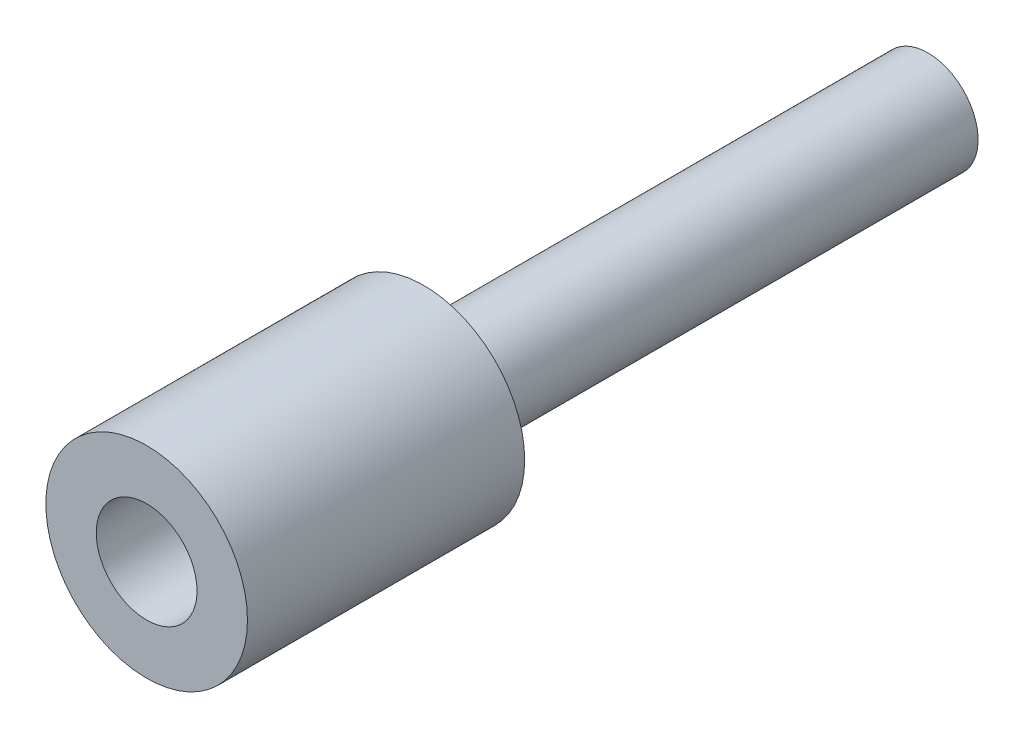
ISO-10303-21;
HEADER;
FILE_DESCRIPTION(('STEP AP214'),'2;1');
FILE_NAME('part.step','',(''),(''),'','','');
FILE_SCHEMA(('AUTOMOTIVE_DESIGN { 1 0 10303 214 1 1 1 1 }'));
ENDSEC;
DATA;
#1=APPLICATION_CONTEXT('core data for automotive mechanical design processes');
#2=APPLICATION_PROTOCOL_DEFINITION('international standard','automotive_design',2000,#1);
#3=PRODUCT_CONTEXT('',#1,'mechanical');
#4=PRODUCT('Part','Part','',(#3));
#5=PRODUCT_RELATED_PRODUCT_CATEGORY('part','',(#4));
#6=PRODUCT_DEFINITION_FORMATION('','',#4);
#7=PRODUCT_DEFINITION_CONTEXT('part definition',#1,'design');
#8=PRODUCT_DEFINITION('design','',#6,#7);
#9=PRODUCT_DEFINITION_SHAPE('','',#8);
#10=(LENGTH_UNIT() NAMED_UNIT(*) SI_UNIT(.MILLI.,.METRE.));
#11=(NAMED_UNIT(*) PLANE_ANGLE_UNIT() SI_UNIT($,.RADIAN.));
#12=(NAMED_UNIT(*) SI_UNIT($,.STERADIAN.) SOLID_ANGLE_UNIT());
#13=UNCERTAINTY_MEASURE_WITH_UNIT(LENGTH_MEASURE(1.E-05),#10,'distance_accuracy_value','');
#14=(GEOMETRIC_REPRESENTATION_CONTEXT(3) GLOBAL_UNCERTAINTY_ASSIGNED_CONTEXT((#13)) GLOBAL_UNIT_ASSIGNED_CONTEXT((#10,
#11,#12)) REPRESENTATION_CONTEXT('',''));
#15=CARTESIAN_POINT('',(0.,0.,0.));
#16=DIRECTION('',(0.,0.,1.));
#17=DIRECTION('',(1.,0.,0.));
#18=AXIS2_PLACEMENT_3D('',#15,#16,#17);
#19=CARTESIAN_POINT('',(0.,0.,-20.));
#20=DIRECTION('',(0.,0.,1.));
#21=DIRECTION('',(1.,0.,0.));
#22=AXIS2_PLACEMENT_3D('',#19,#20,#21);
#23=CYLINDRICAL_SURFACE('',#22,1.99033450503768);
#24=CARTESIAN_POINT('',(0.,0.,-20.));
#25=DIRECTION('',(0.,0.,-1.));
#26=DIRECTION('',(-1.,0.,0.));
#27=AXIS2_PLACEMENT_3D('',#24,#25,#26);
#28=CIRCLE('',#27,1.99033450503768);
#29=CARTESIAN_POINT('',(-1.99033450503768,0.,-20.));
#30=VERTEX_POINT('',#29);
#31=EDGE_CURVE('E11',#30,#30,#28,.T.);
#32=ORIENTED_EDGE('',*,*,#31,.F.);
#33=EDGE_LOOP('',(#32));
#34=FACE_BOUND('',#33,.T.);
#35=CARTESIAN_POINT('',(0.,0.,0.));
#36=DIRECTION('',(0.,0.,-1.));
#37=DIRECTION('',(-1.,0.,0.));
#38=AXIS2_PLACEMENT_3D('',#35,#36,#37);
#39=CIRCLE('',#38,1.99033450503768);
#40=CARTESIAN_POINT('',(-1.99033450503768,0.,0.));
#41=VERTEX_POINT('',#40);
#42=EDGE_CURVE('E46',#41,#41,#39,.T.);
#43=ORIENTED_EDGE('',*,*,#42,.T.);
#44=EDGE_LOOP('',(#43));
#45=FACE_BOUND('',#44,.T.);
#46=ADVANCED_FACE('F43',(#34,#45),#23,.T.);
#47=CARTESIAN_POINT('',(0.,0.,-20.));
#48=DIRECTION('',(0.,0.,-1.));
#49=DIRECTION('',(-1.,0.,0.));
#50=AXIS2_PLACEMENT_3D('',#47,#48,#49);
#51=PLANE('',#50);
#52=ORIENTED_EDGE('',*,*,#31,.T.);
#53=EDGE_LOOP('',(#52));
#54=FACE_BOUND('',#53,.T.);
#55=ADVANCED_FACE('F58',(#54),#51,.T.);
#56=CARTESIAN_POINT('',(0.,0.,0.));
#57=DIRECTION('',(0.,0.,-1.));
#58=DIRECTION('',(-1.,0.,0.));
#59=AXIS2_PLACEMENT_3D('',#56,#57,#58);
#60=PLANE('',#59);
#61=ORIENTED_EDGE('',*,*,#42,.F.);
#62=EDGE_LOOP('',(#61));
#63=FACE_BOUND('',#62,.T.);
#64=ADVANCED_FACE('F56',(#63),#60,.F.);
#65=CLOSED_SHELL('',(#46,#55,#64));
#66=MANIFOLD_SOLID_BREP('B2',#65);
#67=CARTESIAN_POINT('',(0.,0.,11.));
#68=DIRECTION('',(0.,0.,1.));
#69=DIRECTION('',(1.,0.,0.));
#70=AXIS2_PLACEMENT_3D('',#67,#68,#69);
#71=PLANE('',#70);
#72=CARTESIAN_POINT('',(0.,0.,11.));
#73=DIRECTION('',(0.,0.,1.));
#74=DIRECTION('',(1.,0.,0.));
#75=AXIS2_PLACEMENT_3D('',#72,#73,#74);
#76=CIRCLE('',#75,4.);
#77=CARTESIAN_POINT('',(4.,0.,11.));
#78=VERTEX_POINT('',#77);
#79=EDGE_CURVE('E42',#78,#78,#76,.T.);
#80=ORIENTED_EDGE('',*,*,#79,.T.);
#81=EDGE_LOOP('',(#80));
#82=FACE_BOUND('',#81,.T.);
#83=CARTESIAN_POINT('',(0.,0.,11.));
#84=DIRECTION('',(0.,0.,1.));
#85=DIRECTION('',(1.,0.,0.));
#86=AXIS2_PLACEMENT_3D('',#83,#84,#85);
#87=CIRCLE('',#86,2.);
#88=CARTESIAN_POINT('',(2.,0.,11.));
#89=VERTEX_POINT('',#88);
#90=EDGE_CURVE('E95',#89,#89,#87,.T.);
#91=ORIENTED_EDGE('',*,*,#90,.F.);
#92=EDGE_LOOP('',(#91));
#93=FACE_BOUND('',#92,.T.);
#94=ADVANCED_FACE('F84',(#82,#93),#71,.T.);
#95=CARTESIAN_POINT('',(0.,0.,0.));
#96=DIRECTION('',(0.,0.,1.));
#97=DIRECTION('',(1.,0.,0.));
#98=AXIS2_PLACEMENT_3D('',#95,#96,#97);
#99=PLANE('',#98);
#100=CARTESIAN_POINT('',(0.,0.,0.));
#101=DIRECTION('',(0.,0.,1.));
#102=DIRECTION('',(1.,0.,0.));
#103=AXIS2_PLACEMENT_3D('',#100,#101,#102);
#104=CIRCLE('',#103,4.);
#105=CARTESIAN_POINT('',(4.,0.,0.));
#106=VERTEX_POINT('',#105);
#107=EDGE_CURVE('E88',#106,#106,#104,.T.);
#108=ORIENTED_EDGE('',*,*,#107,.F.);
#109=EDGE_LOOP('',(#108));
#110=FACE_BOUND('',#109,.T.);
#111=CARTESIAN_POINT('',(0.,0.,0.));
#112=DIRECTION('',(0.,0.,1.));
#113=DIRECTION('',(1.,0.,0.));
#114=AXIS2_PLACEMENT_3D('',#111,#112,#113);
#115=CIRCLE('',#114,2.);
#116=CARTESIAN_POINT('',(2.,0.,0.));
#117=VERTEX_POINT('',#116);
#118=EDGE_CURVE('E97',#117,#117,#115,.T.);
#119=ORIENTED_EDGE('',*,*,#118,.T.);
#120=EDGE_LOOP('',(#119));
#121=FACE_BOUND('',#120,.T.);
#122=ADVANCED_FACE('F107',(#110,#121),#99,.F.);
#123=CARTESIAN_POINT('',(0.,0.,11.));
#124=DIRECTION('',(0.,0.,-1.));
#125=DIRECTION('',(-1.,0.,0.));
#126=AXIS2_PLACEMENT_3D('',#123,#124,#125);
#127=CYLINDRICAL_SURFACE('',#126,4.);
#128=ORIENTED_EDGE('',*,*,#79,.F.);
#129=EDGE_LOOP('',(#128));
#130=FACE_BOUND('',#129,.T.);
#131=ORIENTED_EDGE('',*,*,#107,.T.);
#132=EDGE_LOOP('',(#131));
#133=FACE_BOUND('',#132,.T.);
#134=ADVANCED_FACE('F86',(#130,#133),#127,.T.);
#135=CARTESIAN_POINT('',(0.,0.,11.));
#136=DIRECTION('',(0.,0.,-1.));
#137=DIRECTION('',(-1.,0.,0.));
#138=AXIS2_PLACEMENT_3D('',#135,#136,#137);
#139=CYLINDRICAL_SURFACE('',#138,2.);
#140=ORIENTED_EDGE('',*,*,#90,.T.);
#141=EDGE_LOOP('',(#140));
#142=FACE_BOUND('',#141,.T.);
#143=ORIENTED_EDGE('',*,*,#118,.F.);
#144=EDGE_LOOP('',(#143));
#145=FACE_BOUND('',#144,.T.);
#146=ADVANCED_FACE('F103',(#142,#145),#139,.F.);
#147=CLOSED_SHELL('',(#94,#122,#134,#146));
#148=MANIFOLD_SOLID_BREP('B6',#147);
#149=ADVANCED_BREP_SHAPE_REPRESENTATION('',(#18,#66,#148),#14);
#150=SHAPE_DEFINITION_REPRESENTATION(#9,#149);
ENDSEC;
END-ISO-10303-21;
